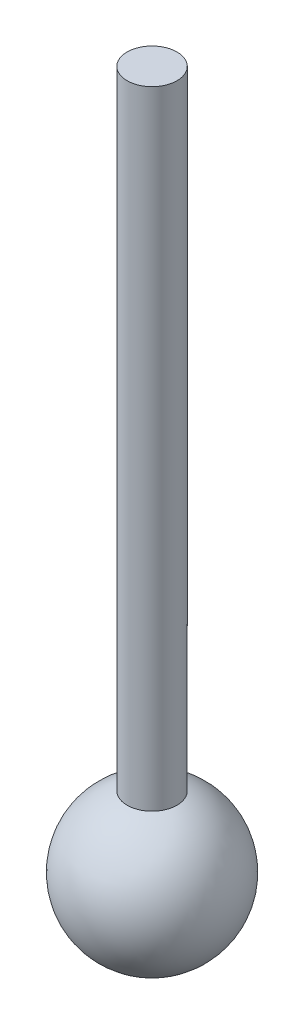
ISO-10303-21;
HEADER;
FILE_DESCRIPTION(('STEP AP214'),'2;1');
FILE_NAME('part.step','',(''),(''),'','','');
FILE_SCHEMA(('AUTOMOTIVE_DESIGN { 1 0 10303 214 1 1 1 1 }'));
ENDSEC;
DATA;
#1=APPLICATION_CONTEXT('core data for automotive mechanical design processes');
#2=APPLICATION_PROTOCOL_DEFINITION('international standard','automotive_design',2000,#1);
#3=PRODUCT_CONTEXT('',#1,'mechanical');
#4=PRODUCT('Part','Part','',(#3));
#5=PRODUCT_RELATED_PRODUCT_CATEGORY('part','',(#4));
#6=PRODUCT_DEFINITION_FORMATION('','',#4);
#7=PRODUCT_DEFINITION_CONTEXT('part definition',#1,'design');
#8=PRODUCT_DEFINITION('design','',#6,#7);
#9=PRODUCT_DEFINITION_SHAPE('','',#8);
#10=(LENGTH_UNIT() NAMED_UNIT(*) SI_UNIT(.MILLI.,.METRE.));
#11=(NAMED_UNIT(*) PLANE_ANGLE_UNIT() SI_UNIT($,.RADIAN.));
#12=(NAMED_UNIT(*) SI_UNIT($,.STERADIAN.) SOLID_ANGLE_UNIT());
#13=UNCERTAINTY_MEASURE_WITH_UNIT(LENGTH_MEASURE(1.E-05),#10,'distance_accuracy_value','');
#14=(GEOMETRIC_REPRESENTATION_CONTEXT(3) GLOBAL_UNCERTAINTY_ASSIGNED_CONTEXT((#13)) GLOBAL_UNIT_ASSIGNED_CONTEXT((#10,
#11,#12)) REPRESENTATION_CONTEXT('',''));
#15=CARTESIAN_POINT('',(0.,0.,0.));
#16=DIRECTION('',(0.,0.,1.));
#17=DIRECTION('',(1.,0.,0.));
#18=AXIS2_PLACEMENT_3D('',#15,#16,#17);
#19=CARTESIAN_POINT('',(0.,158.75,0.));
#20=DIRECTION('',(0.,-1.,0.));
#21=DIRECTION('',(0.,0.,-1.));
#22=AXIS2_PLACEMENT_3D('',#19,#20,#21);
#23=PLANE('',#22);
#24=CARTESIAN_POINT('',(0.,158.75,0.));
#25=DIRECTION('',(0.,-1.,0.));
#26=DIRECTION('',(0.,0.,-1.));
#27=AXIS2_PLACEMENT_3D('',#24,#25,#26);
#28=CIRCLE('',#27,6.35);
#29=CARTESIAN_POINT('',(0.,158.75,-6.35));
#30=VERTEX_POINT('',#29);
#31=EDGE_CURVE('E10',#30,#30,#28,.T.);
#32=ORIENTED_EDGE('',*,*,#31,.F.);
#33=EDGE_LOOP('',(#32));
#34=FACE_BOUND('',#33,.T.);
#35=ADVANCED_FACE('F43',(#34),#23,.F.);
#36=CARTESIAN_POINT('',(0.,0.,0.));
#37=DIRECTION('',(0.,-1.,0.));
#38=DIRECTION('',(0.,0.,-1.));
#39=AXIS2_PLACEMENT_3D('',#36,#37,#38);
#40=CYLINDRICAL_SURFACE('',#39,6.34999999999999);
#41=CARTESIAN_POINT('',(0.,-1.08948775786169,0.));
#42=DIRECTION('',(0.,-1.,0.));
#43=DIRECTION('',(0.,0.,-1.));
#44=AXIS2_PLACEMENT_3D('',#41,#42,#43);
#45=CIRCLE('',#44,6.34999999999998);
#46=CARTESIAN_POINT('',(0.,-1.08948775786169,-6.34999999999998));
#47=VERTEX_POINT('',#46);
#48=EDGE_CURVE('E49',#47,#47,#45,.T.);
#49=ORIENTED_EDGE('',*,*,#48,.F.);
#50=EDGE_LOOP('',(#49));
#51=FACE_BOUND('',#50,.T.);
#52=ORIENTED_EDGE('',*,*,#31,.T.);
#53=EDGE_LOOP('',(#52));
#54=FACE_BOUND('',#53,.T.);
#55=ADVANCED_FACE('F57',(#51,#54),#40,.T.);
#56=CARTESIAN_POINT('',(0.,-19.05,0.));
#57=DIRECTION('',(0.,-1.,0.));
#58=DIRECTION('',(0.,0.,1.));
#59=AXIS2_PLACEMENT_3D('',#56,#57,#58);
#60=SPHERICAL_SURFACE('',#59,19.05);
#61=ORIENTED_EDGE('',*,*,#48,.T.);
#62=EDGE_LOOP('',(#61));
#63=FACE_BOUND('',#62,.T.);
#64=ADVANCED_FACE('F55',(#63),#60,.T.);
#65=CLOSED_SHELL('',(#35,#55,#64));
#66=MANIFOLD_SOLID_BREP('B2',#65);
#67=ADVANCED_BREP_SHAPE_REPRESENTATION('',(#18,#66),#14);
#68=SHAPE_DEFINITION_REPRESENTATION(#9,#67);
ENDSEC;
END-ISO-10303-21;
